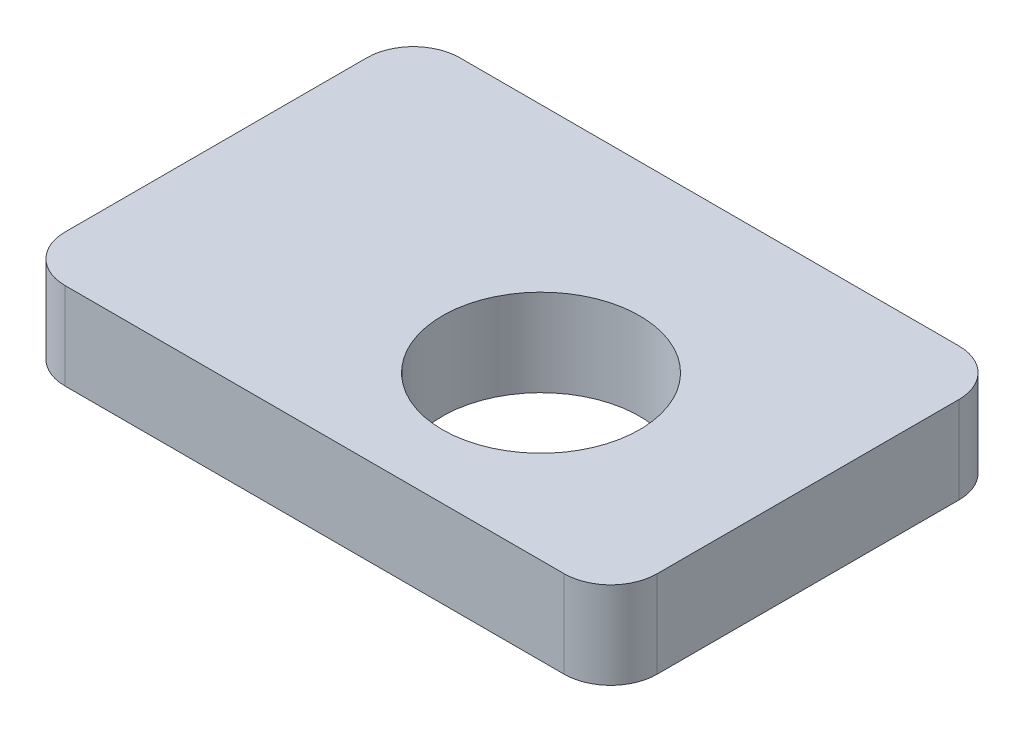
ISO-10303-21;
HEADER;
FILE_DESCRIPTION(('STEP AP214'),'2;1');
FILE_NAME('part.step','',(''),(''),'','','');
FILE_SCHEMA(('AUTOMOTIVE_DESIGN { 1 0 10303 214 1 1 1 1 }'));
ENDSEC;
DATA;
#1=APPLICATION_CONTEXT('core data for automotive mechanical design processes');
#2=APPLICATION_PROTOCOL_DEFINITION('international standard','automotive_design',2000,#1);
#3=PRODUCT_CONTEXT('',#1,'mechanical');
#4=PRODUCT('Part','Part','',(#3));
#5=PRODUCT_RELATED_PRODUCT_CATEGORY('part','',(#4));
#6=PRODUCT_DEFINITION_FORMATION('','',#4);
#7=PRODUCT_DEFINITION_CONTEXT('part definition',#1,'design');
#8=PRODUCT_DEFINITION('design','',#6,#7);
#9=PRODUCT_DEFINITION_SHAPE('','',#8);
#10=(LENGTH_UNIT() NAMED_UNIT(*) SI_UNIT(.MILLI.,.METRE.));
#11=(NAMED_UNIT(*) PLANE_ANGLE_UNIT() SI_UNIT($,.RADIAN.));
#12=(NAMED_UNIT(*) SI_UNIT($,.STERADIAN.) SOLID_ANGLE_UNIT());
#13=UNCERTAINTY_MEASURE_WITH_UNIT(LENGTH_MEASURE(1.E-05),#10,'distance_accuracy_value','');
#14=(GEOMETRIC_REPRESENTATION_CONTEXT(3) GLOBAL_UNCERTAINTY_ASSIGNED_CONTEXT((#13)) GLOBAL_UNIT_ASSIGNED_CONTEXT((#10,
#11,#12)) REPRESENTATION_CONTEXT('',''));
#15=CARTESIAN_POINT('',(0.,0.,0.));
#16=DIRECTION('',(0.,0.,1.));
#17=DIRECTION('',(1.,0.,0.));
#18=AXIS2_PLACEMENT_3D('',#15,#16,#17);
#19=CARTESIAN_POINT('',(0.,7.5,0.));
#20=DIRECTION('',(0.,-1.,0.));
#21=DIRECTION('',(0.,0.,-1.));
#22=AXIS2_PLACEMENT_3D('',#19,#20,#21);
#23=PLANE('',#22);
#24=DIRECTION('',(-1.,0.,0.));
#25=VECTOR('',#24,1.);
#26=CARTESIAN_POINT('',(-31.,7.5,-20.));
#27=LINE('',#26,#25);
#28=CARTESIAN_POINT('',(16.,7.5,-20.));
#29=VERTEX_POINT('',#28);
#30=CARTESIAN_POINT('',(-27.,7.5,-20.));
#31=VERTEX_POINT('',#30);
#32=EDGE_CURVE('E169',#29,#31,#27,.T.);
#33=ORIENTED_EDGE('',*,*,#32,.T.);
#34=CARTESIAN_POINT('',(-27.,7.5,-16.));
#35=DIRECTION('',(0.,-1.,0.));
#36=DIRECTION('',(0.,0.,-1.));
#37=AXIS2_PLACEMENT_3D('',#34,#35,#36);
#38=CIRCLE('',#37,4.);
#39=CARTESIAN_POINT('',(-31.,7.5,-16.));
#40=VERTEX_POINT('',#39);
#41=EDGE_CURVE('E147',#31,#40,#38,.F.);
#42=ORIENTED_EDGE('',*,*,#41,.T.);
#43=DIRECTION('',(0.,0.,1.));
#44=VECTOR('',#43,1.);
#45=CARTESIAN_POINT('',(-31.,7.5,0.));
#46=LINE('',#45,#44);
#47=CARTESIAN_POINT('',(-31.,7.5,10.));
#48=VERTEX_POINT('',#47);
#49=EDGE_CURVE('E117',#40,#48,#46,.T.);
#50=ORIENTED_EDGE('',*,*,#49,.T.);
#51=CARTESIAN_POINT('',(-27.,7.5,10.));
#52=DIRECTION('',(0.,-1.,0.));
#53=DIRECTION('',(0.,0.,-1.));
#54=AXIS2_PLACEMENT_3D('',#51,#52,#53);
#55=CIRCLE('',#54,4.);
#56=CARTESIAN_POINT('',(-27.,7.5,14.));
#57=VERTEX_POINT('',#56);
#58=EDGE_CURVE('E53',#48,#57,#55,.F.);
#59=ORIENTED_EDGE('',*,*,#58,.T.);
#60=DIRECTION('',(1.,0.,0.));
#61=VECTOR('',#60,1.);
#62=CARTESIAN_POINT('',(20.,7.5,14.));
#63=LINE('',#62,#61);
#64=CARTESIAN_POINT('',(16.,7.5,14.));
#65=VERTEX_POINT('',#64);
#66=EDGE_CURVE('E133',#57,#65,#63,.T.);
#67=ORIENTED_EDGE('',*,*,#66,.T.);
#68=CARTESIAN_POINT('',(16.,7.5,9.99999999999999));
#69=DIRECTION('',(0.,-1.,0.));
#70=DIRECTION('',(0.,0.,-1.));
#71=AXIS2_PLACEMENT_3D('',#68,#69,#70);
#72=CIRCLE('',#71,4.);
#73=CARTESIAN_POINT('',(20.,7.5,9.99999999999999));
#74=VERTEX_POINT('',#73);
#75=EDGE_CURVE('E143',#65,#74,#72,.F.);
#76=ORIENTED_EDGE('',*,*,#75,.T.);
#77=DIRECTION('',(0.,0.,-1.));
#78=VECTOR('',#77,1.);
#79=CARTESIAN_POINT('',(20.,7.5,0.));
#80=LINE('',#79,#78);
#81=CARTESIAN_POINT('',(20.,7.5,-16.));
#82=VERTEX_POINT('',#81);
#83=EDGE_CURVE('E127',#74,#82,#80,.T.);
#84=ORIENTED_EDGE('',*,*,#83,.T.);
#85=CARTESIAN_POINT('',(16.,7.5,-16.));
#86=DIRECTION('',(0.,-1.,0.));
#87=DIRECTION('',(0.,0.,-1.));
#88=AXIS2_PLACEMENT_3D('',#85,#86,#87);
#89=CIRCLE('',#88,4.);
#90=EDGE_CURVE('E145',#82,#29,#89,.F.);
#91=ORIENTED_EDGE('',*,*,#90,.T.);
#92=EDGE_LOOP('',(#33,#42,#50,#59,#67,#76,#84,#91));
#93=FACE_BOUND('',#92,.T.);
#94=CARTESIAN_POINT('',(0.,7.5,0.));
#95=DIRECTION('',(0.,1.,0.));
#96=DIRECTION('',(0.,0.,1.));
#97=AXIS2_PLACEMENT_3D('',#94,#95,#96);
#98=CIRCLE('',#97,8.5);
#99=CARTESIAN_POINT('',(0.,7.5,8.5));
#100=VERTEX_POINT('',#99);
#101=EDGE_CURVE('E178',#100,#100,#98,.T.);
#102=ORIENTED_EDGE('',*,*,#101,.F.);
#103=EDGE_LOOP('',(#102));
#104=FACE_BOUND('',#103,.T.);
#105=ADVANCED_FACE('F33',(#93,#104),#23,.F.);
#106=CARTESIAN_POINT('',(0.,0.,0.));
#107=DIRECTION('',(0.,-1.,0.));
#108=DIRECTION('',(0.,0.,-1.));
#109=AXIS2_PLACEMENT_3D('',#106,#107,#108);
#110=PLANE('',#109);
#111=DIRECTION('',(0.,0.,1.));
#112=VECTOR('',#111,1.);
#113=CARTESIAN_POINT('',(-31.,0.,14.));
#114=LINE('',#113,#112);
#115=CARTESIAN_POINT('',(-31.,0.,-16.));
#116=VERTEX_POINT('',#115);
#117=CARTESIAN_POINT('',(-31.,0.,10.));
#118=VERTEX_POINT('',#117);
#119=EDGE_CURVE('E115',#116,#118,#114,.T.);
#120=ORIENTED_EDGE('',*,*,#119,.F.);
#121=CARTESIAN_POINT('',(-27.,0.,-16.));
#122=DIRECTION('',(0.,-1.,0.));
#123=DIRECTION('',(0.,0.,-1.));
#124=AXIS2_PLACEMENT_3D('',#121,#122,#123);
#125=CIRCLE('',#124,4.);
#126=CARTESIAN_POINT('',(-27.,0.,-20.));
#127=VERTEX_POINT('',#126);
#128=EDGE_CURVE('E98',#116,#127,#125,.T.);
#129=ORIENTED_EDGE('',*,*,#128,.T.);
#130=DIRECTION('',(-1.,0.,0.));
#131=VECTOR('',#130,1.);
#132=CARTESIAN_POINT('',(-31.,0.,-20.));
#133=LINE('',#132,#131);
#134=CARTESIAN_POINT('',(16.,0.,-20.));
#135=VERTEX_POINT('',#134);
#136=EDGE_CURVE('E125',#135,#127,#133,.T.);
#137=ORIENTED_EDGE('',*,*,#136,.F.);
#138=CARTESIAN_POINT('',(16.,0.,-16.));
#139=DIRECTION('',(0.,-1.,0.));
#140=DIRECTION('',(0.,0.,-1.));
#141=AXIS2_PLACEMENT_3D('',#138,#139,#140);
#142=CIRCLE('',#141,4.);
#143=CARTESIAN_POINT('',(20.,0.,-16.));
#144=VERTEX_POINT('',#143);
#145=EDGE_CURVE('E109',#135,#144,#142,.T.);
#146=ORIENTED_EDGE('',*,*,#145,.T.);
#147=DIRECTION('',(0.,0.,-1.));
#148=VECTOR('',#147,1.);
#149=CARTESIAN_POINT('',(20.,0.,-20.));
#150=LINE('',#149,#148);
#151=CARTESIAN_POINT('',(20.,0.,9.99999999999999));
#152=VERTEX_POINT('',#151);
#153=EDGE_CURVE('E129',#152,#144,#150,.T.);
#154=ORIENTED_EDGE('',*,*,#153,.F.);
#155=CARTESIAN_POINT('',(16.,0.,9.99999999999999));
#156=DIRECTION('',(0.,-1.,0.));
#157=DIRECTION('',(0.,0.,-1.));
#158=AXIS2_PLACEMENT_3D('',#155,#156,#157);
#159=CIRCLE('',#158,4.);
#160=CARTESIAN_POINT('',(16.,0.,14.));
#161=VERTEX_POINT('',#160);
#162=EDGE_CURVE('E136',#152,#161,#159,.T.);
#163=ORIENTED_EDGE('',*,*,#162,.T.);
#164=DIRECTION('',(1.,0.,0.));
#165=VECTOR('',#164,1.);
#166=CARTESIAN_POINT('',(20.,0.,14.));
#167=LINE('',#166,#165);
#168=CARTESIAN_POINT('',(-27.,0.,14.));
#169=VERTEX_POINT('',#168);
#170=EDGE_CURVE('E124',#169,#161,#167,.T.);
#171=ORIENTED_EDGE('',*,*,#170,.F.);
#172=CARTESIAN_POINT('',(-27.,0.,10.));
#173=DIRECTION('',(0.,-1.,0.));
#174=DIRECTION('',(0.,0.,-1.));
#175=AXIS2_PLACEMENT_3D('',#172,#173,#174);
#176=CIRCLE('',#175,4.);
#177=EDGE_CURVE('E118',#169,#118,#176,.T.);
#178=ORIENTED_EDGE('',*,*,#177,.T.);
#179=EDGE_LOOP('',(#120,#129,#137,#146,#154,#163,#171,#178));
#180=FACE_BOUND('',#179,.T.);
#181=CARTESIAN_POINT('',(0.,0.,0.));
#182=DIRECTION('',(0.,1.,0.));
#183=DIRECTION('',(0.,0.,1.));
#184=AXIS2_PLACEMENT_3D('',#181,#182,#183);
#185=CIRCLE('',#184,8.5);
#186=CARTESIAN_POINT('',(0.,0.,8.5));
#187=VERTEX_POINT('',#186);
#188=EDGE_CURVE('E174',#187,#187,#185,.T.);
#189=ORIENTED_EDGE('',*,*,#188,.T.);
#190=EDGE_LOOP('',(#189));
#191=FACE_BOUND('',#190,.T.);
#192=ADVANCED_FACE('F121',(#180,#191),#110,.T.);
#193=CARTESIAN_POINT('',(20.,7.5,-20.));
#194=DIRECTION('',(-1.,0.,0.));
#195=DIRECTION('',(0.,0.,1.));
#196=AXIS2_PLACEMENT_3D('',#193,#194,#195);
#197=PLANE('',#196);
#198=ORIENTED_EDGE('',*,*,#153,.T.);
#199=DIRECTION('',(0.,-1.,0.));
#200=VECTOR('',#199,1.);
#201=CARTESIAN_POINT('',(20.,7.5,-16.));
#202=LINE('',#201,#200);
#203=EDGE_CURVE('E152',#144,#82,#202,.F.);
#204=ORIENTED_EDGE('',*,*,#203,.T.);
#205=ORIENTED_EDGE('',*,*,#83,.F.);
#206=DIRECTION('',(0.,-1.,0.));
#207=VECTOR('',#206,1.);
#208=CARTESIAN_POINT('',(20.,7.5,9.99999999999999));
#209=LINE('',#208,#207);
#210=EDGE_CURVE('E149',#74,#152,#209,.T.);
#211=ORIENTED_EDGE('',*,*,#210,.T.);
#212=EDGE_LOOP('',(#198,#204,#205,#211));
#213=FACE_BOUND('',#212,.T.);
#214=ADVANCED_FACE('F165',(#213),#197,.F.);
#215=CARTESIAN_POINT('',(-31.,7.5,-20.));
#216=DIRECTION('',(0.,0.,1.));
#217=DIRECTION('',(1.,0.,0.));
#218=AXIS2_PLACEMENT_3D('',#215,#216,#217);
#219=PLANE('',#218);
#220=ORIENTED_EDGE('',*,*,#136,.T.);
#221=DIRECTION('',(0.,-1.,0.));
#222=VECTOR('',#221,1.);
#223=CARTESIAN_POINT('',(-27.,7.5,-20.));
#224=LINE('',#223,#222);
#225=EDGE_CURVE('E103',#127,#31,#224,.F.);
#226=ORIENTED_EDGE('',*,*,#225,.T.);
#227=ORIENTED_EDGE('',*,*,#32,.F.);
#228=DIRECTION('',(0.,-1.,0.));
#229=VECTOR('',#228,1.);
#230=CARTESIAN_POINT('',(16.,7.5,-20.));
#231=LINE('',#230,#229);
#232=EDGE_CURVE('E108',#29,#135,#231,.T.);
#233=ORIENTED_EDGE('',*,*,#232,.T.);
#234=EDGE_LOOP('',(#220,#226,#227,#233));
#235=FACE_BOUND('',#234,.T.);
#236=ADVANCED_FACE('F205',(#235),#219,.F.);
#237=CARTESIAN_POINT('',(-31.,7.5,14.));
#238=DIRECTION('',(1.,0.,0.));
#239=DIRECTION('',(0.,0.,-1.));
#240=AXIS2_PLACEMENT_3D('',#237,#238,#239);
#241=PLANE('',#240);
#242=ORIENTED_EDGE('',*,*,#49,.F.);
#243=DIRECTION('',(0.,-1.,0.));
#244=VECTOR('',#243,1.);
#245=CARTESIAN_POINT('',(-31.,7.5,-16.));
#246=LINE('',#245,#244);
#247=EDGE_CURVE('E102',#40,#116,#246,.T.);
#248=ORIENTED_EDGE('',*,*,#247,.T.);
#249=ORIENTED_EDGE('',*,*,#119,.T.);
#250=DIRECTION('',(0.,-1.,0.));
#251=VECTOR('',#250,1.);
#252=CARTESIAN_POINT('',(-31.,7.5,10.));
#253=LINE('',#252,#251);
#254=EDGE_CURVE('E119',#118,#48,#253,.F.);
#255=ORIENTED_EDGE('',*,*,#254,.T.);
#256=EDGE_LOOP('',(#242,#248,#249,#255));
#257=FACE_BOUND('',#256,.T.);
#258=ADVANCED_FACE('F114',(#257),#241,.F.);
#259=CARTESIAN_POINT('',(20.,7.5,14.));
#260=DIRECTION('',(0.,0.,-1.));
#261=DIRECTION('',(-1.,0.,0.));
#262=AXIS2_PLACEMENT_3D('',#259,#260,#261);
#263=PLANE('',#262);
#264=ORIENTED_EDGE('',*,*,#170,.T.);
#265=DIRECTION('',(0.,-1.,0.));
#266=VECTOR('',#265,1.);
#267=CARTESIAN_POINT('',(16.,7.5,14.));
#268=LINE('',#267,#266);
#269=EDGE_CURVE('E11',#161,#65,#268,.F.);
#270=ORIENTED_EDGE('',*,*,#269,.T.);
#271=ORIENTED_EDGE('',*,*,#66,.F.);
#272=DIRECTION('',(0.,-1.,0.));
#273=VECTOR('',#272,1.);
#274=CARTESIAN_POINT('',(-27.,7.5,14.));
#275=LINE('',#274,#273);
#276=EDGE_CURVE('E41',#57,#169,#275,.T.);
#277=ORIENTED_EDGE('',*,*,#276,.T.);
#278=EDGE_LOOP('',(#264,#270,#271,#277));
#279=FACE_BOUND('',#278,.T.);
#280=ADVANCED_FACE('F155',(#279),#263,.F.);
#281=CARTESIAN_POINT('',(0.,7.5,0.));
#282=DIRECTION('',(0.,-1.,0.));
#283=DIRECTION('',(0.,0.,-1.));
#284=AXIS2_PLACEMENT_3D('',#281,#282,#283);
#285=CYLINDRICAL_SURFACE('',#284,8.5);
#286=ORIENTED_EDGE('',*,*,#101,.T.);
#287=EDGE_LOOP('',(#286));
#288=FACE_BOUND('',#287,.T.);
#289=ORIENTED_EDGE('',*,*,#188,.F.);
#290=EDGE_LOOP('',(#289));
#291=FACE_BOUND('',#290,.T.);
#292=ADVANCED_FACE('F185',(#288,#291),#285,.F.);
#293=CARTESIAN_POINT('',(-27.,7.5,-16.));
#294=DIRECTION('',(0.,-1.,0.));
#295=DIRECTION('',(0.,0.,-1.));
#296=AXIS2_PLACEMENT_3D('',#293,#294,#295);
#297=CYLINDRICAL_SURFACE('',#296,4.);
#298=ORIENTED_EDGE('',*,*,#41,.F.);
#299=ORIENTED_EDGE('',*,*,#225,.F.);
#300=ORIENTED_EDGE('',*,*,#128,.F.);
#301=ORIENTED_EDGE('',*,*,#247,.F.);
#302=EDGE_LOOP('',(#298,#299,#300,#301));
#303=FACE_BOUND('',#302,.T.);
#304=ADVANCED_FACE('F101',(#303),#297,.T.);
#305=CARTESIAN_POINT('',(16.,7.5,-16.));
#306=DIRECTION('',(0.,-1.,0.));
#307=DIRECTION('',(0.,0.,-1.));
#308=AXIS2_PLACEMENT_3D('',#305,#306,#307);
#309=CYLINDRICAL_SURFACE('',#308,4.);
#310=ORIENTED_EDGE('',*,*,#90,.F.);
#311=ORIENTED_EDGE('',*,*,#203,.F.);
#312=ORIENTED_EDGE('',*,*,#145,.F.);
#313=ORIENTED_EDGE('',*,*,#232,.F.);
#314=EDGE_LOOP('',(#310,#311,#312,#313));
#315=FACE_BOUND('',#314,.T.);
#316=ADVANCED_FACE('F192',(#315),#309,.T.);
#317=CARTESIAN_POINT('',(16.,7.5,9.99999999999999));
#318=DIRECTION('',(0.,-1.,0.));
#319=DIRECTION('',(0.,0.,-1.));
#320=AXIS2_PLACEMENT_3D('',#317,#318,#319);
#321=CYLINDRICAL_SURFACE('',#320,4.);
#322=ORIENTED_EDGE('',*,*,#75,.F.);
#323=ORIENTED_EDGE('',*,*,#269,.F.);
#324=ORIENTED_EDGE('',*,*,#162,.F.);
#325=ORIENTED_EDGE('',*,*,#210,.F.);
#326=EDGE_LOOP('',(#322,#323,#324,#325));
#327=FACE_BOUND('',#326,.T.);
#328=ADVANCED_FACE('F162',(#327),#321,.T.);
#329=CARTESIAN_POINT('',(-27.,7.5,10.));
#330=DIRECTION('',(0.,-1.,0.));
#331=DIRECTION('',(0.,0.,-1.));
#332=AXIS2_PLACEMENT_3D('',#329,#330,#331);
#333=CYLINDRICAL_SURFACE('',#332,4.);
#334=ORIENTED_EDGE('',*,*,#58,.F.);
#335=ORIENTED_EDGE('',*,*,#254,.F.);
#336=ORIENTED_EDGE('',*,*,#177,.F.);
#337=ORIENTED_EDGE('',*,*,#276,.F.);
#338=EDGE_LOOP('',(#334,#335,#336,#337));
#339=FACE_BOUND('',#338,.T.);
#340=ADVANCED_FACE('F35',(#339),#333,.T.);
#341=CLOSED_SHELL('',(#105,#192,#214,#236,#258,#280,#292,#304,#316,#328,#340));
#342=MANIFOLD_SOLID_BREP('B2',#341);
#343=ADVANCED_BREP_SHAPE_REPRESENTATION('',(#18,#342),#14);
#344=SHAPE_DEFINITION_REPRESENTATION(#9,#343);
ENDSEC;
END-ISO-10303-21;
